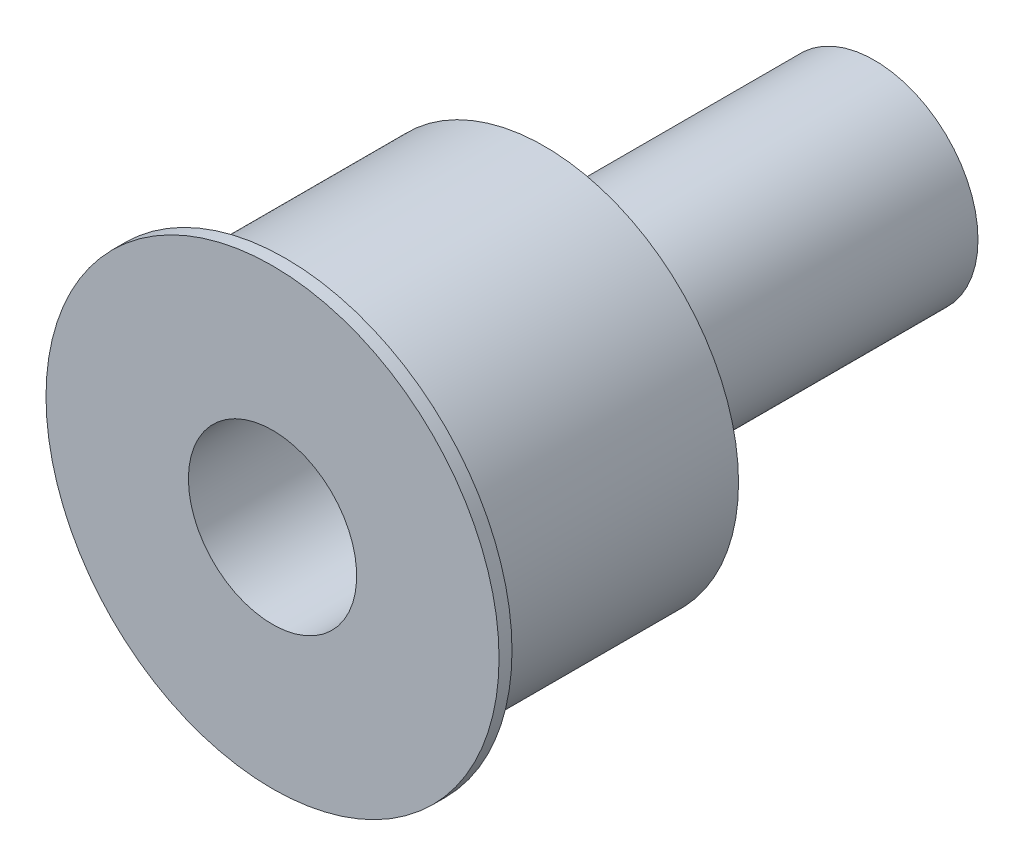
ISO-10303-21;
HEADER;
FILE_DESCRIPTION(('STEP AP214'),'2;1');
FILE_NAME('part.step','',(''),(''),'','','');
FILE_SCHEMA(('AUTOMOTIVE_DESIGN { 1 0 10303 214 1 1 1 1 }'));
ENDSEC;
DATA;
#1=APPLICATION_CONTEXT('core data for automotive mechanical design processes');
#2=APPLICATION_PROTOCOL_DEFINITION('international standard','automotive_design',2000,#1);
#3=PRODUCT_CONTEXT('',#1,'mechanical');
#4=PRODUCT('Part','Part','',(#3));
#5=PRODUCT_RELATED_PRODUCT_CATEGORY('part','',(#4));
#6=PRODUCT_DEFINITION_FORMATION('','',#4);
#7=PRODUCT_DEFINITION_CONTEXT('part definition',#1,'design');
#8=PRODUCT_DEFINITION('design','',#6,#7);
#9=PRODUCT_DEFINITION_SHAPE('','',#8);
#10=(LENGTH_UNIT() NAMED_UNIT(*) SI_UNIT(.MILLI.,.METRE.));
#11=(NAMED_UNIT(*) PLANE_ANGLE_UNIT() SI_UNIT($,.RADIAN.));
#12=(NAMED_UNIT(*) SI_UNIT($,.STERADIAN.) SOLID_ANGLE_UNIT());
#13=UNCERTAINTY_MEASURE_WITH_UNIT(LENGTH_MEASURE(1.E-05),#10,'distance_accuracy_value','');
#14=(GEOMETRIC_REPRESENTATION_CONTEXT(3) GLOBAL_UNCERTAINTY_ASSIGNED_CONTEXT((#13)) GLOBAL_UNIT_ASSIGNED_CONTEXT((#10,
#11,#12)) REPRESENTATION_CONTEXT('',''));
#15=CARTESIAN_POINT('',(0.,0.,0.));
#16=DIRECTION('',(0.,0.,1.));
#17=DIRECTION('',(1.,0.,0.));
#18=AXIS2_PLACEMENT_3D('',#15,#16,#17);
#19=CARTESIAN_POINT('',(-3.61666252501891E-12,-9.37916411203332E-13,-472.369237082393));
#20=DIRECTION('',(0.,0.,-1.));
#21=DIRECTION('',(-1.,0.,0.));
#22=AXIS2_PLACEMENT_3D('',#19,#20,#21);
#23=CYLINDRICAL_SURFACE('',#22,30.);
#24=CARTESIAN_POINT('',(-3.611610995706E-12,-9.37916421442305E-13,-381.369237082393));
#25=DIRECTION('',(0.,0.,-1.));
#26=DIRECTION('',(-1.,0.,0.));
#27=AXIS2_PLACEMENT_3D('',#24,#25,#26);
#28=CIRCLE('',#27,30.);
#29=CARTESIAN_POINT('',(-30.0000000000036,-9.37916421442305E-13,-381.369237082393));
#30=VERTEX_POINT('',#29);
#31=EDGE_CURVE('E18',#30,#30,#28,.T.);
#32=ORIENTED_EDGE('',*,*,#31,.T.);
#33=EDGE_LOOP('',(#32));
#34=FACE_BOUND('',#33,.T.);
#35=CARTESIAN_POINT('',(-3.61383144815123E-12,-9.37916416941658E-13,-421.369237082393));
#36=DIRECTION('',(0.,0.,-1.));
#37=DIRECTION('',(-1.,0.,0.));
#38=AXIS2_PLACEMENT_3D('',#35,#36,#37);
#39=CIRCLE('',#38,30.);
#40=CARTESIAN_POINT('',(-30.0000000000036,-9.37916416941658E-13,-421.369237082393));
#41=VERTEX_POINT('',#40);
#42=EDGE_CURVE('E40',#41,#41,#39,.F.);
#43=ORIENTED_EDGE('',*,*,#42,.T.);
#44=EDGE_LOOP('',(#43));
#45=FACE_BOUND('',#44,.T.);
#46=ADVANCED_FACE('F15',(#34,#45),#23,.T.);
#47=CARTESIAN_POINT('',(20.2973939744632,22.0910795989068,-381.369237082393));
#48=DIRECTION('',(0.,0.,1.));
#49=DIRECTION('',(0.,-1.,0.));
#50=AXIS2_PLACEMENT_3D('',#47,#48,#49);
#51=PLANE('',#50);
#52=CARTESIAN_POINT('',(-3.611610995706E-12,-9.37916421442305E-13,-381.369237082393));
#53=DIRECTION('',(0.,0.,-1.));
#54=DIRECTION('',(-1.,0.,0.));
#55=AXIS2_PLACEMENT_3D('',#52,#53,#54);
#56=CIRCLE('',#55,35.);
#57=CARTESIAN_POINT('',(-35.0000000000036,-9.37916421442305E-13,-381.369237082393));
#58=VERTEX_POINT('',#57);
#59=EDGE_CURVE('E38',#58,#58,#56,.F.);
#60=ORIENTED_EDGE('',*,*,#59,.F.);
#61=EDGE_LOOP('',(#60));
#62=FACE_BOUND('',#61,.T.);
#63=ORIENTED_EDGE('',*,*,#31,.F.);
#64=EDGE_LOOP('',(#63));
#65=FACE_BOUND('',#64,.T.);
#66=ADVANCED_FACE('F48',(#62,#65),#51,.F.);
#67=CARTESIAN_POINT('',(10.8252767863787,11.7819091194166,-421.369237082393));
#68=DIRECTION('',(0.,0.,1.));
#69=DIRECTION('',(0.,-1.,0.));
#70=AXIS2_PLACEMENT_3D('',#67,#68,#69);
#71=PLANE('',#70);
#72=ORIENTED_EDGE('',*,*,#42,.F.);
#73=EDGE_LOOP('',(#72));
#74=FACE_BOUND('',#73,.T.);
#75=CARTESIAN_POINT('',(-3.61383144815123E-12,-9.37916416941658E-13,-421.369237082393));
#76=DIRECTION('',(0.,0.,-1.));
#77=DIRECTION('',(-1.,0.,0.));
#78=AXIS2_PLACEMENT_3D('',#75,#76,#77);
#79=CIRCLE('',#78,16.);
#80=CARTESIAN_POINT('',(-16.0000000000036,-9.37916416941658E-13,-421.369237082393));
#81=VERTEX_POINT('',#80);
#82=EDGE_CURVE('E35',#81,#81,#79,.T.);
#83=ORIENTED_EDGE('',*,*,#82,.F.);
#84=EDGE_LOOP('',(#83));
#85=FACE_BOUND('',#84,.T.);
#86=ADVANCED_FACE('F50',(#74,#85),#71,.F.);
#87=CARTESIAN_POINT('',(-3.61666252501891E-12,-9.37916411203332E-13,-472.369237082393));
#88=DIRECTION('',(0.,0.,-1.));
#89=DIRECTION('',(-1.,0.,0.));
#90=AXIS2_PLACEMENT_3D('',#87,#88,#89);
#91=CYLINDRICAL_SURFACE('',#90,35.);
#92=ORIENTED_EDGE('',*,*,#59,.T.);
#93=EDGE_LOOP('',(#92));
#94=FACE_BOUND('',#93,.T.);
#95=CARTESIAN_POINT('',(-3.61149997308374E-12,-9.37916421667337E-13,-379.369237082393));
#96=DIRECTION('',(0.,0.,-1.));
#97=DIRECTION('',(-1.,0.,0.));
#98=AXIS2_PLACEMENT_3D('',#95,#96,#97);
#99=CIRCLE('',#98,35.);
#100=CARTESIAN_POINT('',(-35.0000000000036,-9.37916421667337E-13,-379.369237082393));
#101=VERTEX_POINT('',#100);
#102=EDGE_CURVE('E32',#101,#101,#99,.T.);
#103=ORIENTED_EDGE('',*,*,#102,.T.);
#104=EDGE_LOOP('',(#103));
#105=FACE_BOUND('',#104,.T.);
#106=ADVANCED_FACE('F57',(#94,#105),#91,.T.);
#107=CARTESIAN_POINT('',(-3.61666252501891E-12,-9.37916411203332E-13,-472.369237082393));
#108=DIRECTION('',(0.,0.,-1.));
#109=DIRECTION('',(-1.,0.,0.));
#110=AXIS2_PLACEMENT_3D('',#107,#108,#109);
#111=CYLINDRICAL_SURFACE('',#110,16.);
#112=ORIENTED_EDGE('',*,*,#82,.T.);
#113=EDGE_LOOP('',(#112));
#114=FACE_BOUND('',#113,.T.);
#115=CARTESIAN_POINT('',(-3.61666252501891E-12,-9.37916411203332E-13,-472.369237082393));
#116=DIRECTION('',(0.,0.,-1.));
#117=DIRECTION('',(-1.,0.,0.));
#118=AXIS2_PLACEMENT_3D('',#115,#116,#117);
#119=CIRCLE('',#118,16.);
#120=CARTESIAN_POINT('',(-16.0000000000036,-9.37916411203332E-13,-472.369237082393));
#121=VERTEX_POINT('',#120);
#122=EDGE_CURVE('E27',#121,#121,#119,.F.);
#123=ORIENTED_EDGE('',*,*,#122,.T.);
#124=EDGE_LOOP('',(#123));
#125=FACE_BOUND('',#124,.T.);
#126=ADVANCED_FACE('F76',(#114,#125),#111,.T.);
#127=CARTESIAN_POINT('',(23.6802929702076,25.7729261987248,-379.369237082393));
#128=DIRECTION('',(0.,0.,-1.));
#129=DIRECTION('',(-1.,0.,0.));
#130=AXIS2_PLACEMENT_3D('',#127,#128,#129);
#131=PLANE('',#130);
#132=CARTESIAN_POINT('',(-3.61149997308374E-12,-9.37916421667337E-13,-379.369237082393));
#133=DIRECTION('',(0.,0.,-1.));
#134=DIRECTION('',(-1.,0.,0.));
#135=AXIS2_PLACEMENT_3D('',#132,#133,#134);
#136=CIRCLE('',#135,13.);
#137=CARTESIAN_POINT('',(-13.0000000000036,-9.37916421667337E-13,-379.369237082393));
#138=VERTEX_POINT('',#137);
#139=EDGE_CURVE('E22',#138,#138,#136,.T.);
#140=ORIENTED_EDGE('',*,*,#139,.T.);
#141=EDGE_LOOP('',(#140));
#142=FACE_BOUND('',#141,.T.);
#143=ORIENTED_EDGE('',*,*,#102,.F.);
#144=EDGE_LOOP('',(#143));
#145=FACE_BOUND('',#144,.T.);
#146=ADVANCED_FACE('F69',(#142,#145),#131,.F.);
#147=CARTESIAN_POINT('',(8.79553738893198,9.57280115952577,-472.369237082393));
#148=DIRECTION('',(0.,0.,1.));
#149=DIRECTION('',(0.,-1.,0.));
#150=AXIS2_PLACEMENT_3D('',#147,#148,#149);
#151=PLANE('',#150);
#152=ORIENTED_EDGE('',*,*,#122,.F.);
#153=EDGE_LOOP('',(#152));
#154=FACE_BOUND('',#153,.T.);
#155=CARTESIAN_POINT('',(-3.61666252501891E-12,-9.37916411203332E-13,-472.369237082393));
#156=DIRECTION('',(0.,0.,-1.));
#157=DIRECTION('',(-1.,0.,0.));
#158=AXIS2_PLACEMENT_3D('',#155,#156,#157);
#159=CIRCLE('',#158,13.);
#160=CARTESIAN_POINT('',(-13.0000000000036,-9.37916411203332E-13,-472.369237082393));
#161=VERTEX_POINT('',#160);
#162=EDGE_CURVE('E10',#161,#161,#159,.F.);
#163=ORIENTED_EDGE('',*,*,#162,.T.);
#164=EDGE_LOOP('',(#163));
#165=FACE_BOUND('',#164,.T.);
#166=ADVANCED_FACE('F63',(#154,#165),#151,.F.);
#167=CARTESIAN_POINT('',(-3.61666252501891E-12,-9.37916411203332E-13,-472.369237082393));
#168=DIRECTION('',(0.,0.,-1.));
#169=DIRECTION('',(-1.,0.,0.));
#170=AXIS2_PLACEMENT_3D('',#167,#168,#169);
#171=CYLINDRICAL_SURFACE('',#170,13.);
#172=ORIENTED_EDGE('',*,*,#162,.F.);
#173=EDGE_LOOP('',(#172));
#174=FACE_BOUND('',#173,.T.);
#175=ORIENTED_EDGE('',*,*,#139,.F.);
#176=EDGE_LOOP('',(#175));
#177=FACE_BOUND('',#176,.T.);
#178=ADVANCED_FACE('F61',(#174,#177),#171,.F.);
#179=CLOSED_SHELL('',(#46,#66,#86,#106,#126,#146,#166,#178));
#180=MANIFOLD_SOLID_BREP('B1',#179);
#181=ADVANCED_BREP_SHAPE_REPRESENTATION('',(#18,#180),#14);
#182=SHAPE_DEFINITION_REPRESENTATION(#9,#181);
ENDSEC;
END-ISO-10303-21;
